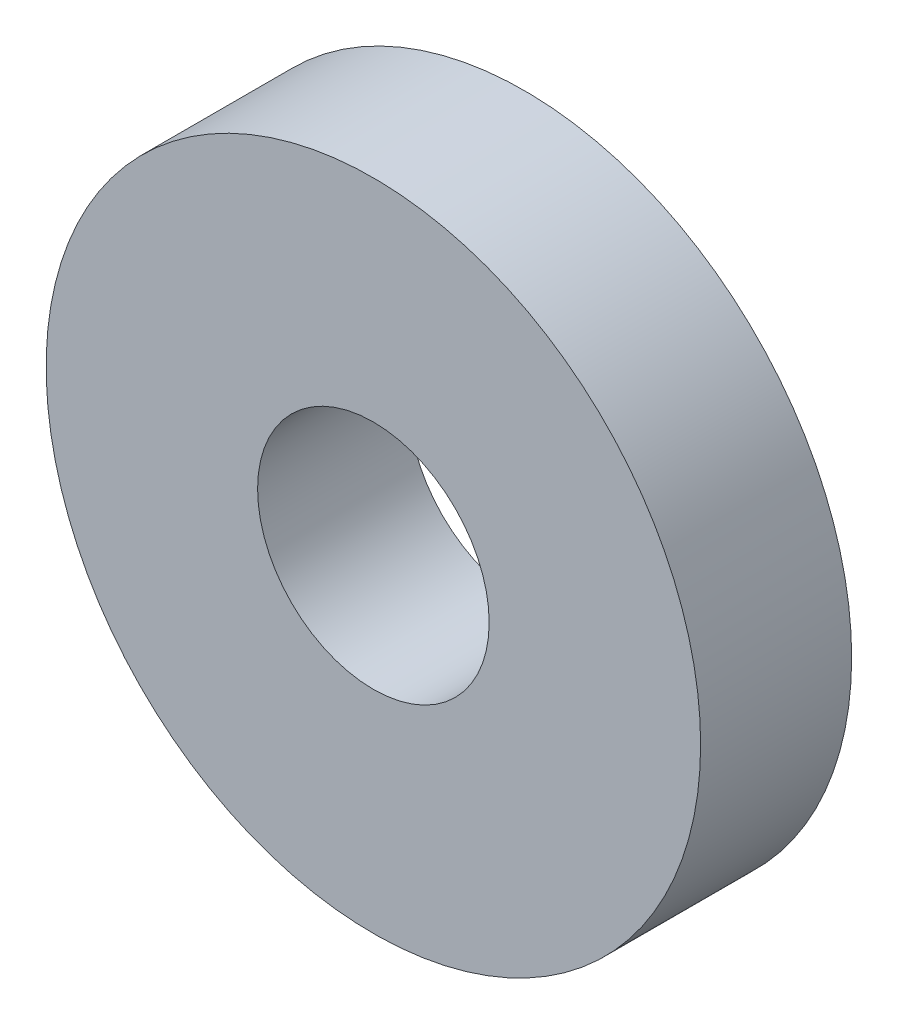
ISO-10303-21;
HEADER;
FILE_DESCRIPTION(('STEP AP214'),'2;1');
FILE_NAME('part.step','',(''),(''),'','','');
FILE_SCHEMA(('AUTOMOTIVE_DESIGN { 1 0 10303 214 1 1 1 1 }'));
ENDSEC;
DATA;
#1=APPLICATION_CONTEXT('core data for automotive mechanical design processes');
#2=APPLICATION_PROTOCOL_DEFINITION('international standard','automotive_design',2000,#1);
#3=PRODUCT_CONTEXT('',#1,'mechanical');
#4=PRODUCT('Part','Part','',(#3));
#5=PRODUCT_RELATED_PRODUCT_CATEGORY('part','',(#4));
#6=PRODUCT_DEFINITION_FORMATION('','',#4);
#7=PRODUCT_DEFINITION_CONTEXT('part definition',#1,'design');
#8=PRODUCT_DEFINITION('design','',#6,#7);
#9=PRODUCT_DEFINITION_SHAPE('','',#8);
#10=(LENGTH_UNIT() NAMED_UNIT(*) SI_UNIT(.MILLI.,.METRE.));
#11=(NAMED_UNIT(*) PLANE_ANGLE_UNIT() SI_UNIT($,.RADIAN.));
#12=(NAMED_UNIT(*) SI_UNIT($,.STERADIAN.) SOLID_ANGLE_UNIT());
#13=UNCERTAINTY_MEASURE_WITH_UNIT(LENGTH_MEASURE(1.E-05),#10,'distance_accuracy_value','');
#14=(GEOMETRIC_REPRESENTATION_CONTEXT(3) GLOBAL_UNCERTAINTY_ASSIGNED_CONTEXT((#13)) GLOBAL_UNIT_ASSIGNED_CONTEXT((#10,
#11,#12)) REPRESENTATION_CONTEXT('',''));
#15=CARTESIAN_POINT('',(0.,0.,0.));
#16=DIRECTION('',(0.,0.,1.));
#17=DIRECTION('',(1.,0.,0.));
#18=AXIS2_PLACEMENT_3D('',#15,#16,#17);
#19=CARTESIAN_POINT('',(0.,0.,4.5));
#20=DIRECTION('',(0.,0.,-1.));
#21=DIRECTION('',(-1.,0.,0.));
#22=AXIS2_PLACEMENT_3D('',#19,#20,#21);
#23=CYLINDRICAL_SURFACE('',#22,9.75);
#24=CARTESIAN_POINT('',(0.,0.,4.5));
#25=DIRECTION('',(0.,0.,1.));
#26=DIRECTION('',(1.,0.,0.));
#27=AXIS2_PLACEMENT_3D('',#24,#25,#26);
#28=CIRCLE('',#27,9.75);
#29=CARTESIAN_POINT('',(9.75,0.,4.5));
#30=VERTEX_POINT('',#29);
#31=EDGE_CURVE('E10',#30,#30,#28,.T.);
#32=ORIENTED_EDGE('',*,*,#31,.F.);
#33=EDGE_LOOP('',(#32));
#34=FACE_BOUND('',#33,.T.);
#35=CARTESIAN_POINT('',(0.,0.,0.));
#36=DIRECTION('',(0.,0.,1.));
#37=DIRECTION('',(1.,0.,0.));
#38=AXIS2_PLACEMENT_3D('',#35,#36,#37);
#39=CIRCLE('',#38,9.75);
#40=CARTESIAN_POINT('',(9.75,0.,0.));
#41=VERTEX_POINT('',#40);
#42=EDGE_CURVE('E40',#41,#41,#39,.T.);
#43=ORIENTED_EDGE('',*,*,#42,.T.);
#44=EDGE_LOOP('',(#43));
#45=FACE_BOUND('',#44,.T.);
#46=ADVANCED_FACE('F37',(#34,#45),#23,.T.);
#47=CARTESIAN_POINT('',(0.,0.,4.5));
#48=DIRECTION('',(0.,0.,1.));
#49=DIRECTION('',(1.,0.,0.));
#50=AXIS2_PLACEMENT_3D('',#47,#48,#49);
#51=PLANE('',#50);
#52=CARTESIAN_POINT('',(0.,0.,4.5));
#53=DIRECTION('',(0.,0.,1.));
#54=DIRECTION('',(1.,0.,0.));
#55=AXIS2_PLACEMENT_3D('',#52,#53,#54);
#56=CIRCLE('',#55,3.45);
#57=CARTESIAN_POINT('',(3.45,0.,4.5));
#58=VERTEX_POINT('',#57);
#59=EDGE_CURVE('E49',#58,#58,#56,.T.);
#60=ORIENTED_EDGE('',*,*,#59,.F.);
#61=EDGE_LOOP('',(#60));
#62=FACE_BOUND('',#61,.T.);
#63=ORIENTED_EDGE('',*,*,#31,.T.);
#64=EDGE_LOOP('',(#63));
#65=FACE_BOUND('',#64,.T.);
#66=ADVANCED_FACE('F64',(#62,#65),#51,.T.);
#67=CARTESIAN_POINT('',(0.,0.,0.));
#68=DIRECTION('',(0.,0.,1.));
#69=DIRECTION('',(1.,0.,0.));
#70=AXIS2_PLACEMENT_3D('',#67,#68,#69);
#71=PLANE('',#70);
#72=CARTESIAN_POINT('',(0.,0.,0.));
#73=DIRECTION('',(0.,0.,1.));
#74=DIRECTION('',(1.,0.,0.));
#75=AXIS2_PLACEMENT_3D('',#72,#73,#74);
#76=CIRCLE('',#75,3.45);
#77=CARTESIAN_POINT('',(3.45,0.,0.));
#78=VERTEX_POINT('',#77);
#79=EDGE_CURVE('E47',#78,#78,#76,.T.);
#80=ORIENTED_EDGE('',*,*,#79,.T.);
#81=EDGE_LOOP('',(#80));
#82=FACE_BOUND('',#81,.T.);
#83=ORIENTED_EDGE('',*,*,#42,.F.);
#84=EDGE_LOOP('',(#83));
#85=FACE_BOUND('',#84,.T.);
#86=ADVANCED_FACE('F55',(#82,#85),#71,.F.);
#87=CARTESIAN_POINT('',(0.,0.,0.));
#88=DIRECTION('',(0.,0.,1.));
#89=DIRECTION('',(1.,0.,0.));
#90=AXIS2_PLACEMENT_3D('',#87,#88,#89);
#91=CYLINDRICAL_SURFACE('',#90,3.45);
#92=ORIENTED_EDGE('',*,*,#79,.F.);
#93=EDGE_LOOP('',(#92));
#94=FACE_BOUND('',#93,.T.);
#95=ORIENTED_EDGE('',*,*,#59,.T.);
#96=EDGE_LOOP('',(#95));
#97=FACE_BOUND('',#96,.T.);
#98=ADVANCED_FACE('F58',(#94,#97),#91,.F.);
#99=CLOSED_SHELL('',(#46,#66,#86,#98));
#100=MANIFOLD_SOLID_BREP('B2',#99);
#101=ADVANCED_BREP_SHAPE_REPRESENTATION('',(#18,#100),#14);
#102=SHAPE_DEFINITION_REPRESENTATION(#9,#101);
ENDSEC;
END-ISO-10303-21;
